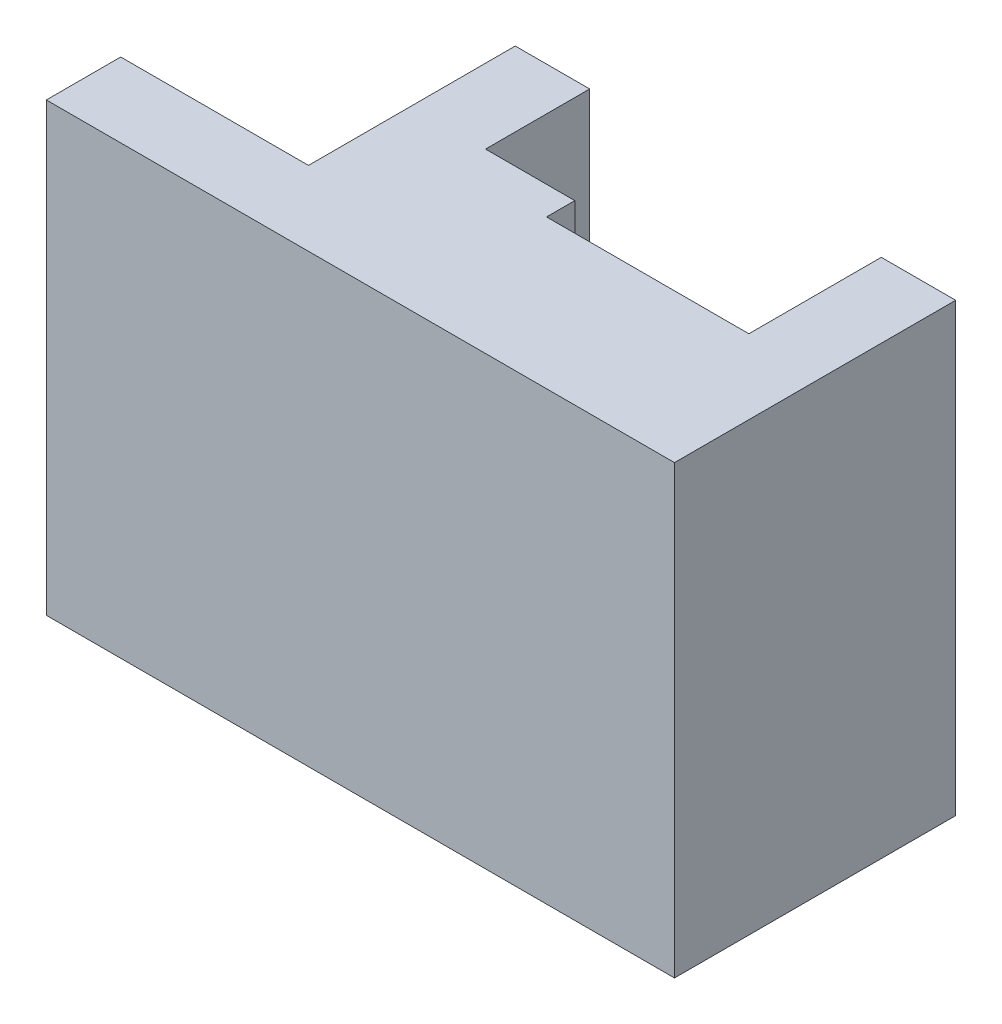
ISO-10303-21;
HEADER;
FILE_DESCRIPTION(('STEP AP214'),'2;1');
FILE_NAME('part.step','',(''),(''),'','','');
FILE_SCHEMA(('AUTOMOTIVE_DESIGN { 1 0 10303 214 1 1 1 1 }'));
ENDSEC;
DATA;
#1=APPLICATION_CONTEXT('core data for automotive mechanical design processes');
#2=APPLICATION_PROTOCOL_DEFINITION('international standard','automotive_design',2000,#1);
#3=PRODUCT_CONTEXT('',#1,'mechanical');
#4=PRODUCT('Part','Part','',(#3));
#5=PRODUCT_RELATED_PRODUCT_CATEGORY('part','',(#4));
#6=PRODUCT_DEFINITION_FORMATION('','',#4);
#7=PRODUCT_DEFINITION_CONTEXT('part definition',#1,'design');
#8=PRODUCT_DEFINITION('design','',#6,#7);
#9=PRODUCT_DEFINITION_SHAPE('','',#8);
#10=(LENGTH_UNIT() NAMED_UNIT(*) SI_UNIT(.MILLI.,.METRE.));
#11=(NAMED_UNIT(*) PLANE_ANGLE_UNIT() SI_UNIT($,.RADIAN.));
#12=(NAMED_UNIT(*) SI_UNIT($,.STERADIAN.) SOLID_ANGLE_UNIT());
#13=UNCERTAINTY_MEASURE_WITH_UNIT(LENGTH_MEASURE(1.E-05),#10,'distance_accuracy_value','');
#14=(GEOMETRIC_REPRESENTATION_CONTEXT(3) GLOBAL_UNCERTAINTY_ASSIGNED_CONTEXT((#13)) GLOBAL_UNIT_ASSIGNED_CONTEXT((#10,
#11,#12)) REPRESENTATION_CONTEXT('',''));
#15=CARTESIAN_POINT('',(0.,0.,0.));
#16=DIRECTION('',(0.,0.,1.));
#17=DIRECTION('',(1.,0.,0.));
#18=AXIS2_PLACEMENT_3D('',#15,#16,#17);
#19=CARTESIAN_POINT('',(47.2694,38.1,-12.7));
#20=DIRECTION('',(1.,0.,0.));
#21=DIRECTION('',(0.,0.,-1.));
#22=AXIS2_PLACEMENT_3D('',#19,#20,#21);
#23=PLANE('',#22);
#24=DIRECTION('',(0.,0.,1.));
#25=VECTOR('',#24,1.);
#26=CARTESIAN_POINT('',(47.2694,0.,-12.7));
#27=LINE('',#26,#25);
#28=CARTESIAN_POINT('',(47.2694,0.,-24.003));
#29=VERTEX_POINT('',#28);
#30=CARTESIAN_POINT('',(47.2694,0.,-12.7));
#31=VERTEX_POINT('',#30);
#32=EDGE_CURVE('E164',#29,#31,#27,.T.);
#33=ORIENTED_EDGE('',*,*,#32,.T.);
#34=DIRECTION('',(0.,-1.,0.));
#35=VECTOR('',#34,1.);
#36=CARTESIAN_POINT('',(47.2694,38.1,-12.7));
#37=LINE('',#36,#35);
#38=CARTESIAN_POINT('',(47.2694,38.1,-12.7));
#39=VERTEX_POINT('',#38);
#40=EDGE_CURVE('E11',#39,#31,#37,.T.);
#41=ORIENTED_EDGE('',*,*,#40,.F.);
#42=DIRECTION('',(0.,0.,1.));
#43=VECTOR('',#42,1.);
#44=CARTESIAN_POINT('',(47.2694,38.1,-12.7));
#45=LINE('',#44,#43);
#46=CARTESIAN_POINT('',(47.2694,38.1,-24.003));
#47=VERTEX_POINT('',#46);
#48=EDGE_CURVE('E198',#47,#39,#45,.T.);
#49=ORIENTED_EDGE('',*,*,#48,.F.);
#50=DIRECTION('',(0.,-1.,0.));
#51=VECTOR('',#50,1.);
#52=CARTESIAN_POINT('',(47.2694,38.1,-24.003));
#53=LINE('',#52,#51);
#54=EDGE_CURVE('E160',#47,#29,#53,.T.);
#55=ORIENTED_EDGE('',*,*,#54,.T.);
#56=EDGE_LOOP('',(#33,#41,#49,#55));
#57=FACE_BOUND('',#56,.T.);
#58=ADVANCED_FACE('F39',(#57),#23,.F.);
#59=CARTESIAN_POINT('',(29.9974,38.1,-12.7));
#60=DIRECTION('',(0.,0.,1.));
#61=DIRECTION('',(1.,0.,0.));
#62=AXIS2_PLACEMENT_3D('',#59,#60,#61);
#63=PLANE('',#62);
#64=DIRECTION('',(-1.,0.,0.));
#65=VECTOR('',#64,1.);
#66=CARTESIAN_POINT('',(29.9974,0.,-12.7));
#67=LINE('',#66,#65);
#68=CARTESIAN_POINT('',(29.9974,0.,-12.7));
#69=VERTEX_POINT('',#68);
#70=EDGE_CURVE('E168',#31,#69,#67,.T.);
#71=ORIENTED_EDGE('',*,*,#70,.T.);
#72=DIRECTION('',(0.,-1.,0.));
#73=VECTOR('',#72,1.);
#74=CARTESIAN_POINT('',(29.9974,38.1,-12.7));
#75=LINE('',#74,#73);
#76=CARTESIAN_POINT('',(29.9974,38.1,-12.7));
#77=VERTEX_POINT('',#76);
#78=EDGE_CURVE('E48',#77,#69,#75,.T.);
#79=ORIENTED_EDGE('',*,*,#78,.F.);
#80=DIRECTION('',(-1.,0.,0.));
#81=VECTOR('',#80,1.);
#82=CARTESIAN_POINT('',(29.9974,38.1,-12.7));
#83=LINE('',#82,#81);
#84=EDGE_CURVE('E111',#39,#77,#83,.T.);
#85=ORIENTED_EDGE('',*,*,#84,.F.);
#86=ORIENTED_EDGE('',*,*,#40,.T.);
#87=EDGE_LOOP('',(#71,#79,#85,#86));
#88=FACE_BOUND('',#87,.T.);
#89=ADVANCED_FACE('F292',(#88),#63,.F.);
#90=CARTESIAN_POINT('',(29.9974,38.1,-15.113));
#91=DIRECTION('',(-1.,0.,0.));
#92=DIRECTION('',(0.,0.,1.));
#93=AXIS2_PLACEMENT_3D('',#90,#91,#92);
#94=PLANE('',#93);
#95=DIRECTION('',(0.,0.,-1.));
#96=VECTOR('',#95,1.);
#97=CARTESIAN_POINT('',(29.9974,0.,-15.113));
#98=LINE('',#97,#96);
#99=CARTESIAN_POINT('',(29.9974,0.,-15.113));
#100=VERTEX_POINT('',#99);
#101=EDGE_CURVE('E171',#69,#100,#98,.T.);
#102=ORIENTED_EDGE('',*,*,#101,.T.);
#103=DIRECTION('',(0.,-1.,0.));
#104=VECTOR('',#103,1.);
#105=CARTESIAN_POINT('',(29.9974,38.1,-15.113));
#106=LINE('',#105,#104);
#107=CARTESIAN_POINT('',(29.9974,38.1,-15.113));
#108=VERTEX_POINT('',#107);
#109=EDGE_CURVE('E225',#108,#100,#106,.T.);
#110=ORIENTED_EDGE('',*,*,#109,.F.);
#111=DIRECTION('',(0.,0.,-1.));
#112=VECTOR('',#111,1.);
#113=CARTESIAN_POINT('',(29.9974,38.1,-15.113));
#114=LINE('',#113,#112);
#115=EDGE_CURVE('E235',#77,#108,#114,.T.);
#116=ORIENTED_EDGE('',*,*,#115,.F.);
#117=ORIENTED_EDGE('',*,*,#78,.T.);
#118=EDGE_LOOP('',(#102,#110,#116,#117));
#119=FACE_BOUND('',#118,.T.);
#120=ADVANCED_FACE('F233',(#119),#94,.F.);
#121=CARTESIAN_POINT('',(22.3774,38.1,-15.113));
#122=DIRECTION('',(0.,0.,1.));
#123=DIRECTION('',(1.,0.,0.));
#124=AXIS2_PLACEMENT_3D('',#121,#122,#123);
#125=PLANE('',#124);
#126=DIRECTION('',(-1.,0.,0.));
#127=VECTOR('',#126,1.);
#128=CARTESIAN_POINT('',(22.3774,0.,-15.113));
#129=LINE('',#128,#127);
#130=CARTESIAN_POINT('',(22.3774,0.,-15.113));
#131=VERTEX_POINT('',#130);
#132=EDGE_CURVE('E174',#100,#131,#129,.T.);
#133=ORIENTED_EDGE('',*,*,#132,.T.);
#134=DIRECTION('',(0.,-1.,0.));
#135=VECTOR('',#134,1.);
#136=CARTESIAN_POINT('',(22.3774,38.1,-15.113));
#137=LINE('',#136,#135);
#138=CARTESIAN_POINT('',(22.3774,38.1,-15.113));
#139=VERTEX_POINT('',#138);
#140=EDGE_CURVE('E221',#139,#131,#137,.T.);
#141=ORIENTED_EDGE('',*,*,#140,.F.);
#142=DIRECTION('',(-1.,0.,0.));
#143=VECTOR('',#142,1.);
#144=CARTESIAN_POINT('',(22.3774,38.1,-15.113));
#145=LINE('',#144,#143);
#146=EDGE_CURVE('E254',#108,#139,#145,.T.);
#147=ORIENTED_EDGE('',*,*,#146,.F.);
#148=ORIENTED_EDGE('',*,*,#109,.T.);
#149=EDGE_LOOP('',(#133,#141,#147,#148));
#150=FACE_BOUND('',#149,.T.);
#151=ADVANCED_FACE('F244',(#150),#125,.F.);
#152=CARTESIAN_POINT('',(22.3774,38.1,-24.003));
#153=DIRECTION('',(-1.,0.,0.));
#154=DIRECTION('',(0.,0.,1.));
#155=AXIS2_PLACEMENT_3D('',#152,#153,#154);
#156=PLANE('',#155);
#157=DIRECTION('',(0.,0.,-1.));
#158=VECTOR('',#157,1.);
#159=CARTESIAN_POINT('',(22.3774,0.,-24.003));
#160=LINE('',#159,#158);
#161=CARTESIAN_POINT('',(22.3774,0.,-24.003));
#162=VERTEX_POINT('',#161);
#163=EDGE_CURVE('E177',#131,#162,#160,.T.);
#164=ORIENTED_EDGE('',*,*,#163,.T.);
#165=DIRECTION('',(0.,-1.,0.));
#166=VECTOR('',#165,1.);
#167=CARTESIAN_POINT('',(22.3774,38.1,-24.003));
#168=LINE('',#167,#166);
#169=CARTESIAN_POINT('',(22.3774,38.1,-24.003));
#170=VERTEX_POINT('',#169);
#171=EDGE_CURVE('E217',#170,#162,#168,.T.);
#172=ORIENTED_EDGE('',*,*,#171,.F.);
#173=DIRECTION('',(0.,0.,-1.));
#174=VECTOR('',#173,1.);
#175=CARTESIAN_POINT('',(22.3774,38.1,-24.003));
#176=LINE('',#175,#174);
#177=EDGE_CURVE('E250',#139,#170,#176,.T.);
#178=ORIENTED_EDGE('',*,*,#177,.F.);
#179=ORIENTED_EDGE('',*,*,#140,.T.);
#180=EDGE_LOOP('',(#164,#172,#178,#179));
#181=FACE_BOUND('',#180,.T.);
#182=ADVANCED_FACE('F248',(#181),#156,.F.);
#183=CARTESIAN_POINT('',(16.0274,38.1,-24.003));
#184=DIRECTION('',(0.,0.,1.));
#185=DIRECTION('',(1.,0.,0.));
#186=AXIS2_PLACEMENT_3D('',#183,#184,#185);
#187=PLANE('',#186);
#188=DIRECTION('',(-1.,0.,0.));
#189=VECTOR('',#188,1.);
#190=CARTESIAN_POINT('',(16.0274,0.,-24.003));
#191=LINE('',#190,#189);
#192=CARTESIAN_POINT('',(16.0274,0.,-24.003));
#193=VERTEX_POINT('',#192);
#194=EDGE_CURVE('E180',#162,#193,#191,.T.);
#195=ORIENTED_EDGE('',*,*,#194,.T.);
#196=DIRECTION('',(0.,-1.,0.));
#197=VECTOR('',#196,1.);
#198=CARTESIAN_POINT('',(16.0274,38.1,-24.003));
#199=LINE('',#198,#197);
#200=CARTESIAN_POINT('',(16.0274,38.1,-24.003));
#201=VERTEX_POINT('',#200);
#202=EDGE_CURVE('E213',#201,#193,#199,.T.);
#203=ORIENTED_EDGE('',*,*,#202,.F.);
#204=DIRECTION('',(-1.,0.,0.));
#205=VECTOR('',#204,1.);
#206=CARTESIAN_POINT('',(16.0274,38.1,-24.003));
#207=LINE('',#206,#205);
#208=EDGE_CURVE('E253',#170,#201,#207,.T.);
#209=ORIENTED_EDGE('',*,*,#208,.F.);
#210=ORIENTED_EDGE('',*,*,#171,.T.);
#211=EDGE_LOOP('',(#195,#203,#209,#210));
#212=FACE_BOUND('',#211,.T.);
#213=ADVANCED_FACE('F305',(#212),#187,.F.);
#214=CARTESIAN_POINT('',(16.0274,38.1,-6.34999999999999));
#215=DIRECTION('',(1.,0.,0.));
#216=DIRECTION('',(0.,0.,-1.));
#217=AXIS2_PLACEMENT_3D('',#214,#215,#216);
#218=PLANE('',#217);
#219=DIRECTION('',(0.,0.,1.));
#220=VECTOR('',#219,1.);
#221=CARTESIAN_POINT('',(16.0274,0.,-6.34999999999999));
#222=LINE('',#221,#220);
#223=CARTESIAN_POINT('',(16.0274,0.,-6.34999999999999));
#224=VERTEX_POINT('',#223);
#225=EDGE_CURVE('E183',#193,#224,#222,.T.);
#226=ORIENTED_EDGE('',*,*,#225,.T.);
#227=DIRECTION('',(0.,-1.,0.));
#228=VECTOR('',#227,1.);
#229=CARTESIAN_POINT('',(16.0274,38.1,-6.34999999999999));
#230=LINE('',#229,#228);
#231=CARTESIAN_POINT('',(16.0274,38.1,-6.34999999999999));
#232=VERTEX_POINT('',#231);
#233=EDGE_CURVE('E209',#232,#224,#230,.T.);
#234=ORIENTED_EDGE('',*,*,#233,.F.);
#235=DIRECTION('',(0.,0.,1.));
#236=VECTOR('',#235,1.);
#237=CARTESIAN_POINT('',(16.0274,38.1,-6.34999999999999));
#238=LINE('',#237,#236);
#239=EDGE_CURVE('E258',#201,#232,#238,.T.);
#240=ORIENTED_EDGE('',*,*,#239,.F.);
#241=ORIENTED_EDGE('',*,*,#202,.T.);
#242=EDGE_LOOP('',(#226,#234,#240,#241));
#243=FACE_BOUND('',#242,.T.);
#244=ADVANCED_FACE('F308',(#243),#218,.F.);
#245=CARTESIAN_POINT('',(0.,38.1,-6.34999999999999));
#246=DIRECTION('',(0.,0.,1.));
#247=DIRECTION('',(1.,0.,0.));
#248=AXIS2_PLACEMENT_3D('',#245,#246,#247);
#249=PLANE('',#248);
#250=DIRECTION('',(-1.,0.,0.));
#251=VECTOR('',#250,1.);
#252=CARTESIAN_POINT('',(0.,0.,-6.34999999999999));
#253=LINE('',#252,#251);
#254=CARTESIAN_POINT('',(0.,0.,-6.34999999999999));
#255=VERTEX_POINT('',#254);
#256=EDGE_CURVE('E186',#224,#255,#253,.T.);
#257=ORIENTED_EDGE('',*,*,#256,.T.);
#258=DIRECTION('',(0.,-1.,0.));
#259=VECTOR('',#258,1.);
#260=CARTESIAN_POINT('',(0.,38.1,-6.34999999999999));
#261=LINE('',#260,#259);
#262=CARTESIAN_POINT('',(0.,38.1,-6.34999999999999));
#263=VERTEX_POINT('',#262);
#264=EDGE_CURVE('E205',#263,#255,#261,.T.);
#265=ORIENTED_EDGE('',*,*,#264,.F.);
#266=DIRECTION('',(-1.,0.,0.));
#267=VECTOR('',#266,1.);
#268=CARTESIAN_POINT('',(0.,38.1,-6.34999999999999));
#269=LINE('',#268,#267);
#270=EDGE_CURVE('E265',#232,#263,#269,.T.);
#271=ORIENTED_EDGE('',*,*,#270,.F.);
#272=ORIENTED_EDGE('',*,*,#233,.T.);
#273=EDGE_LOOP('',(#257,#265,#271,#272));
#274=FACE_BOUND('',#273,.T.);
#275=ADVANCED_FACE('F273',(#274),#249,.F.);
#276=CARTESIAN_POINT('',(0.,38.1,0.));
#277=DIRECTION('',(1.,0.,0.));
#278=DIRECTION('',(0.,0.,-1.));
#279=AXIS2_PLACEMENT_3D('',#276,#277,#278);
#280=PLANE('',#279);
#281=DIRECTION('',(0.,0.,1.));
#282=VECTOR('',#281,1.);
#283=CARTESIAN_POINT('',(0.,0.,0.));
#284=LINE('',#283,#282);
#285=CARTESIAN_POINT('',(0.,0.,0.));
#286=VERTEX_POINT('',#285);
#287=EDGE_CURVE('E189',#255,#286,#284,.T.);
#288=ORIENTED_EDGE('',*,*,#287,.T.);
#289=DIRECTION('',(0.,-1.,0.));
#290=VECTOR('',#289,1.);
#291=CARTESIAN_POINT('',(0.,38.1,0.));
#292=LINE('',#291,#290);
#293=CARTESIAN_POINT('',(0.,38.1,0.));
#294=VERTEX_POINT('',#293);
#295=EDGE_CURVE('E153',#294,#286,#292,.T.);
#296=ORIENTED_EDGE('',*,*,#295,.F.);
#297=DIRECTION('',(0.,0.,1.));
#298=VECTOR('',#297,1.);
#299=CARTESIAN_POINT('',(0.,38.1,0.));
#300=LINE('',#299,#298);
#301=EDGE_CURVE('E142',#263,#294,#300,.T.);
#302=ORIENTED_EDGE('',*,*,#301,.F.);
#303=ORIENTED_EDGE('',*,*,#264,.T.);
#304=EDGE_LOOP('',(#288,#296,#302,#303));
#305=FACE_BOUND('',#304,.T.);
#306=ADVANCED_FACE('F277',(#305),#280,.F.);
#307=CARTESIAN_POINT('',(53.6194,38.1,0.));
#308=DIRECTION('',(0.,0.,-1.));
#309=DIRECTION('',(-1.,0.,0.));
#310=AXIS2_PLACEMENT_3D('',#307,#308,#309);
#311=PLANE('',#310);
#312=DIRECTION('',(1.,0.,0.));
#313=VECTOR('',#312,1.);
#314=CARTESIAN_POINT('',(53.6194,0.,0.));
#315=LINE('',#314,#313);
#316=CARTESIAN_POINT('',(53.6194,0.,0.));
#317=VERTEX_POINT('',#316);
#318=EDGE_CURVE('E151',#286,#317,#315,.T.);
#319=ORIENTED_EDGE('',*,*,#318,.T.);
#320=DIRECTION('',(0.,-1.,0.));
#321=VECTOR('',#320,1.);
#322=CARTESIAN_POINT('',(53.6194,38.1,0.));
#323=LINE('',#322,#321);
#324=CARTESIAN_POINT('',(53.6194,38.1,0.));
#325=VERTEX_POINT('',#324);
#326=EDGE_CURVE('E148',#325,#317,#323,.T.);
#327=ORIENTED_EDGE('',*,*,#326,.F.);
#328=DIRECTION('',(1.,0.,0.));
#329=VECTOR('',#328,1.);
#330=CARTESIAN_POINT('',(53.6194,38.1,0.));
#331=LINE('',#330,#329);
#332=EDGE_CURVE('E136',#294,#325,#331,.T.);
#333=ORIENTED_EDGE('',*,*,#332,.F.);
#334=ORIENTED_EDGE('',*,*,#295,.T.);
#335=EDGE_LOOP('',(#319,#327,#333,#334));
#336=FACE_BOUND('',#335,.T.);
#337=ADVANCED_FACE('F149',(#336),#311,.F.);
#338=CARTESIAN_POINT('',(53.6194,38.1,-24.003));
#339=DIRECTION('',(-1.,0.,0.));
#340=DIRECTION('',(0.,0.,1.));
#341=AXIS2_PLACEMENT_3D('',#338,#339,#340);
#342=PLANE('',#341);
#343=DIRECTION('',(0.,0.,-1.));
#344=VECTOR('',#343,1.);
#345=CARTESIAN_POINT('',(53.6194,0.,-24.003));
#346=LINE('',#345,#344);
#347=CARTESIAN_POINT('',(53.6194,0.,-24.003));
#348=VERTEX_POINT('',#347);
#349=EDGE_CURVE('E97',#317,#348,#346,.T.);
#350=ORIENTED_EDGE('',*,*,#349,.T.);
#351=DIRECTION('',(0.,-1.,0.));
#352=VECTOR('',#351,1.);
#353=CARTESIAN_POINT('',(53.6194,38.1,-24.003));
#354=LINE('',#353,#352);
#355=CARTESIAN_POINT('',(53.6194,38.1,-24.003));
#356=VERTEX_POINT('',#355);
#357=EDGE_CURVE('E154',#356,#348,#354,.T.);
#358=ORIENTED_EDGE('',*,*,#357,.F.);
#359=DIRECTION('',(0.,0.,-1.));
#360=VECTOR('',#359,1.);
#361=CARTESIAN_POINT('',(53.6194,38.1,-24.003));
#362=LINE('',#361,#360);
#363=EDGE_CURVE('E140',#325,#356,#362,.T.);
#364=ORIENTED_EDGE('',*,*,#363,.F.);
#365=ORIENTED_EDGE('',*,*,#326,.T.);
#366=EDGE_LOOP('',(#350,#358,#364,#365));
#367=FACE_BOUND('',#366,.T.);
#368=ADVANCED_FACE('F156',(#367),#342,.F.);
#369=CARTESIAN_POINT('',(47.2694,38.1,-24.003));
#370=DIRECTION('',(0.,0.,1.));
#371=DIRECTION('',(1.,0.,0.));
#372=AXIS2_PLACEMENT_3D('',#369,#370,#371);
#373=PLANE('',#372);
#374=DIRECTION('',(-1.,0.,0.));
#375=VECTOR('',#374,1.);
#376=CARTESIAN_POINT('',(47.2694,0.,-24.003));
#377=LINE('',#376,#375);
#378=EDGE_CURVE('E103',#348,#29,#377,.T.);
#379=ORIENTED_EDGE('',*,*,#378,.T.);
#380=ORIENTED_EDGE('',*,*,#54,.F.);
#381=DIRECTION('',(-1.,0.,0.));
#382=VECTOR('',#381,1.);
#383=CARTESIAN_POINT('',(47.2694,38.1,-24.003));
#384=LINE('',#383,#382);
#385=EDGE_CURVE('E56',#356,#47,#384,.T.);
#386=ORIENTED_EDGE('',*,*,#385,.F.);
#387=ORIENTED_EDGE('',*,*,#357,.T.);
#388=EDGE_LOOP('',(#379,#380,#386,#387));
#389=FACE_BOUND('',#388,.T.);
#390=ADVANCED_FACE('F281',(#389),#373,.F.);
#391=CARTESIAN_POINT('',(0.,38.1,0.));
#392=DIRECTION('',(0.,-1.,0.));
#393=DIRECTION('',(0.,0.,-1.));
#394=AXIS2_PLACEMENT_3D('',#391,#392,#393);
#395=PLANE('',#394);
#396=ORIENTED_EDGE('',*,*,#48,.T.);
#397=ORIENTED_EDGE('',*,*,#84,.T.);
#398=ORIENTED_EDGE('',*,*,#115,.T.);
#399=ORIENTED_EDGE('',*,*,#146,.T.);
#400=ORIENTED_EDGE('',*,*,#177,.T.);
#401=ORIENTED_EDGE('',*,*,#208,.T.);
#402=ORIENTED_EDGE('',*,*,#239,.T.);
#403=ORIENTED_EDGE('',*,*,#270,.T.);
#404=ORIENTED_EDGE('',*,*,#301,.T.);
#405=ORIENTED_EDGE('',*,*,#332,.T.);
#406=ORIENTED_EDGE('',*,*,#363,.T.);
#407=ORIENTED_EDGE('',*,*,#385,.T.);
#408=EDGE_LOOP('',(#396,#397,#398,#399,#400,#401,#402,#403,#404,#405,#406,#407));
#409=FACE_BOUND('',#408,.T.);
#410=ADVANCED_FACE('F138',(#409),#395,.F.);
#411=CARTESIAN_POINT('',(0.,0.,0.));
#412=DIRECTION('',(0.,-1.,0.));
#413=DIRECTION('',(0.,0.,-1.));
#414=AXIS2_PLACEMENT_3D('',#411,#412,#413);
#415=PLANE('',#414);
#416=ORIENTED_EDGE('',*,*,#32,.F.);
#417=ORIENTED_EDGE('',*,*,#378,.F.);
#418=ORIENTED_EDGE('',*,*,#349,.F.);
#419=ORIENTED_EDGE('',*,*,#318,.F.);
#420=ORIENTED_EDGE('',*,*,#287,.F.);
#421=ORIENTED_EDGE('',*,*,#256,.F.);
#422=ORIENTED_EDGE('',*,*,#225,.F.);
#423=ORIENTED_EDGE('',*,*,#194,.F.);
#424=ORIENTED_EDGE('',*,*,#163,.F.);
#425=ORIENTED_EDGE('',*,*,#132,.F.);
#426=ORIENTED_EDGE('',*,*,#101,.F.);
#427=ORIENTED_EDGE('',*,*,#70,.F.);
#428=EDGE_LOOP('',(#416,#417,#418,#419,#420,#421,#422,#423,#424,#425,#426,#427));
#429=FACE_BOUND('',#428,.T.);
#430=ADVANCED_FACE('F239',(#429),#415,.T.);
#431=CLOSED_SHELL('',(#58,#89,#120,#151,#182,#213,#244,#275,#306,#337,#368,#390,#410,#430));
#432=MANIFOLD_SOLID_BREP('B2',#431);
#433=ADVANCED_BREP_SHAPE_REPRESENTATION('',(#18,#432),#14);
#434=SHAPE_DEFINITION_REPRESENTATION(#9,#433);
ENDSEC;
END-ISO-10303-21;
